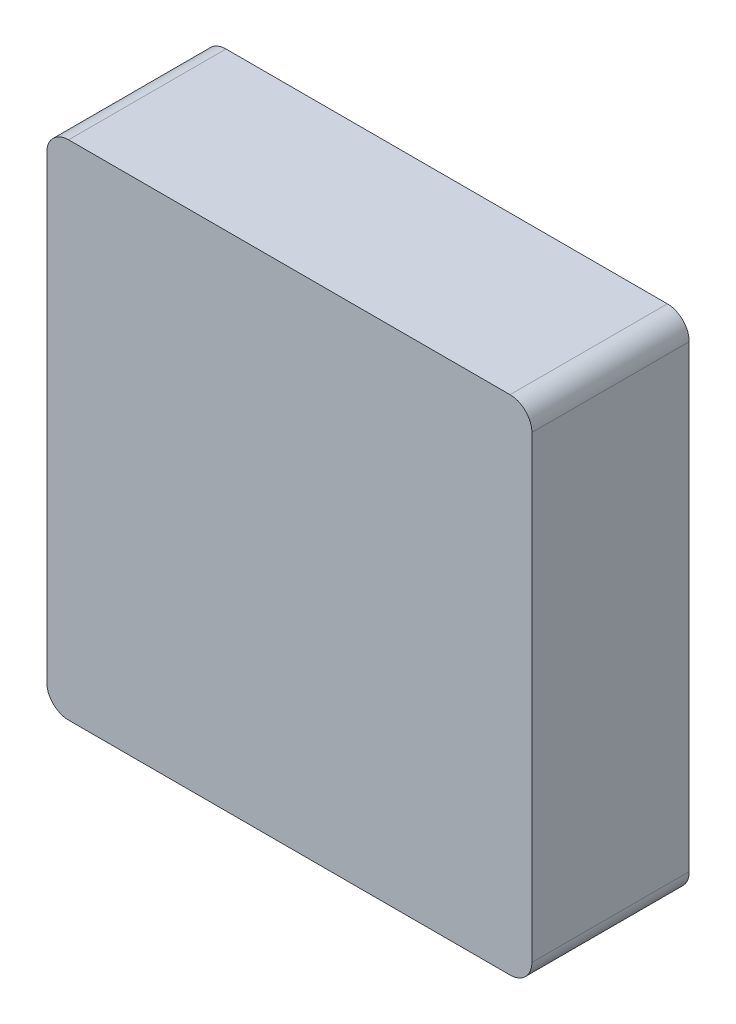
ISO-10303-21;
HEADER;
FILE_DESCRIPTION(('STEP AP214'),'2;1');
FILE_NAME('part.step','',(''),(''),'','','');
FILE_SCHEMA(('AUTOMOTIVE_DESIGN { 1 0 10303 214 1 1 1 1 }'));
ENDSEC;
DATA;
#1=APPLICATION_CONTEXT('core data for automotive mechanical design processes');
#2=APPLICATION_PROTOCOL_DEFINITION('international standard','automotive_design',2000,#1);
#3=PRODUCT_CONTEXT('',#1,'mechanical');
#4=PRODUCT('Part','Part','',(#3));
#5=PRODUCT_RELATED_PRODUCT_CATEGORY('part','',(#4));
#6=PRODUCT_DEFINITION_FORMATION('','',#4);
#7=PRODUCT_DEFINITION_CONTEXT('part definition',#1,'design');
#8=PRODUCT_DEFINITION('design','',#6,#7);
#9=PRODUCT_DEFINITION_SHAPE('','',#8);
#10=(LENGTH_UNIT() NAMED_UNIT(*) SI_UNIT(.MILLI.,.METRE.));
#11=(NAMED_UNIT(*) PLANE_ANGLE_UNIT() SI_UNIT($,.RADIAN.));
#12=(NAMED_UNIT(*) SI_UNIT($,.STERADIAN.) SOLID_ANGLE_UNIT());
#13=UNCERTAINTY_MEASURE_WITH_UNIT(LENGTH_MEASURE(1.E-05),#10,'distance_accuracy_value','');
#14=(GEOMETRIC_REPRESENTATION_CONTEXT(3) GLOBAL_UNCERTAINTY_ASSIGNED_CONTEXT((#13)) GLOBAL_UNIT_ASSIGNED_CONTEXT((#10,
#11,#12)) REPRESENTATION_CONTEXT('',''));
#15=CARTESIAN_POINT('',(0.,0.,0.));
#16=DIRECTION('',(0.,0.,1.));
#17=DIRECTION('',(1.,0.,0.));
#18=AXIS2_PLACEMENT_3D('',#15,#16,#17);
#19=CARTESIAN_POINT('',(55.5,-57.5,36.));
#20=DIRECTION('',(-1.,0.,0.));
#21=DIRECTION('',(0.,0.,1.));
#22=AXIS2_PLACEMENT_3D('',#19,#20,#21);
#23=PLANE('',#22);
#24=DIRECTION('',(0.,1.,0.));
#25=VECTOR('',#24,1.);
#26=CARTESIAN_POINT('',(55.5,-57.5,36.));
#27=LINE('',#26,#25);
#28=CARTESIAN_POINT('',(55.5,-52.5,36.));
#29=VERTEX_POINT('',#28);
#30=CARTESIAN_POINT('',(55.5,52.5,36.));
#31=VERTEX_POINT('',#30);
#32=EDGE_CURVE('E122',#29,#31,#27,.T.);
#33=ORIENTED_EDGE('',*,*,#32,.F.);
#34=DIRECTION('',(0.,0.,-1.));
#35=VECTOR('',#34,1.);
#36=CARTESIAN_POINT('',(55.5,-52.5,36.));
#37=LINE('',#36,#35);
#38=CARTESIAN_POINT('',(55.5,-52.5,0.));
#39=VERTEX_POINT('',#38);
#40=EDGE_CURVE('E107',#29,#39,#37,.T.);
#41=ORIENTED_EDGE('',*,*,#40,.T.);
#42=DIRECTION('',(0.,1.,0.));
#43=VECTOR('',#42,1.);
#44=CARTESIAN_POINT('',(55.5,-57.5,0.));
#45=LINE('',#44,#43);
#46=CARTESIAN_POINT('',(55.5,52.5,0.));
#47=VERTEX_POINT('',#46);
#48=EDGE_CURVE('E119',#39,#47,#45,.T.);
#49=ORIENTED_EDGE('',*,*,#48,.T.);
#50=DIRECTION('',(0.,0.,-1.));
#51=VECTOR('',#50,1.);
#52=CARTESIAN_POINT('',(55.5,52.5,36.));
#53=LINE('',#52,#51);
#54=EDGE_CURVE('E124',#47,#31,#53,.F.);
#55=ORIENTED_EDGE('',*,*,#54,.T.);
#56=EDGE_LOOP('',(#33,#41,#49,#55));
#57=FACE_BOUND('',#56,.T.);
#58=ADVANCED_FACE('F36',(#57),#23,.F.);
#59=CARTESIAN_POINT('',(-55.5,57.5,36.));
#60=DIRECTION('',(0.,-1.,0.));
#61=DIRECTION('',(0.,0.,-1.));
#62=AXIS2_PLACEMENT_3D('',#59,#60,#61);
#63=PLANE('',#62);
#64=DIRECTION('',(-1.,0.,0.));
#65=VECTOR('',#64,1.);
#66=CARTESIAN_POINT('',(-55.5,57.5,36.));
#67=LINE('',#66,#65);
#68=CARTESIAN_POINT('',(50.5,57.5,36.));
#69=VERTEX_POINT('',#68);
#70=CARTESIAN_POINT('',(-50.5,57.5,36.));
#71=VERTEX_POINT('',#70);
#72=EDGE_CURVE('E162',#69,#71,#67,.T.);
#73=ORIENTED_EDGE('',*,*,#72,.F.);
#74=DIRECTION('',(0.,0.,-1.));
#75=VECTOR('',#74,1.);
#76=CARTESIAN_POINT('',(50.5,57.5,36.));
#77=LINE('',#76,#75);
#78=CARTESIAN_POINT('',(50.5,57.5,0.));
#79=VERTEX_POINT('',#78);
#80=EDGE_CURVE('E11',#69,#79,#77,.T.);
#81=ORIENTED_EDGE('',*,*,#80,.T.);
#82=DIRECTION('',(-1.,0.,0.));
#83=VECTOR('',#82,1.);
#84=CARTESIAN_POINT('',(-55.5,57.5,0.));
#85=LINE('',#84,#83);
#86=CARTESIAN_POINT('',(-50.5,57.5,0.));
#87=VERTEX_POINT('',#86);
#88=EDGE_CURVE('E129',#79,#87,#85,.T.);
#89=ORIENTED_EDGE('',*,*,#88,.T.);
#90=DIRECTION('',(0.,0.,-1.));
#91=VECTOR('',#90,1.);
#92=CARTESIAN_POINT('',(-50.5,57.5,36.));
#93=LINE('',#92,#91);
#94=EDGE_CURVE('E44',#87,#71,#93,.F.);
#95=ORIENTED_EDGE('',*,*,#94,.T.);
#96=EDGE_LOOP('',(#73,#81,#89,#95));
#97=FACE_BOUND('',#96,.T.);
#98=ADVANCED_FACE('F161',(#97),#63,.F.);
#99=CARTESIAN_POINT('',(-55.5,-57.5,36.));
#100=DIRECTION('',(1.,0.,0.));
#101=DIRECTION('',(0.,0.,-1.));
#102=AXIS2_PLACEMENT_3D('',#99,#100,#101);
#103=PLANE('',#102);
#104=DIRECTION('',(0.,-1.,0.));
#105=VECTOR('',#104,1.);
#106=CARTESIAN_POINT('',(-55.5,-57.5,0.));
#107=LINE('',#106,#105);
#108=CARTESIAN_POINT('',(-55.5,52.5,0.));
#109=VERTEX_POINT('',#108);
#110=CARTESIAN_POINT('',(-55.5,-52.5,0.));
#111=VERTEX_POINT('',#110);
#112=EDGE_CURVE('E132',#109,#111,#107,.T.);
#113=ORIENTED_EDGE('',*,*,#112,.T.);
#114=DIRECTION('',(0.,0.,-1.));
#115=VECTOR('',#114,1.);
#116=CARTESIAN_POINT('',(-55.5,-52.5,36.));
#117=LINE('',#116,#115);
#118=CARTESIAN_POINT('',(-55.5,-52.5,36.));
#119=VERTEX_POINT('',#118);
#120=EDGE_CURVE('E51',#111,#119,#117,.F.);
#121=ORIENTED_EDGE('',*,*,#120,.T.);
#122=DIRECTION('',(0.,-1.,0.));
#123=VECTOR('',#122,1.);
#124=CARTESIAN_POINT('',(-55.5,-57.5,36.));
#125=LINE('',#124,#123);
#126=CARTESIAN_POINT('',(-55.5,52.5,36.));
#127=VERTEX_POINT('',#126);
#128=EDGE_CURVE('E168',#127,#119,#125,.T.);
#129=ORIENTED_EDGE('',*,*,#128,.F.);
#130=DIRECTION('',(0.,0.,-1.));
#131=VECTOR('',#130,1.);
#132=CARTESIAN_POINT('',(-55.5,52.5,36.));
#133=LINE('',#132,#131);
#134=EDGE_CURVE('E155',#127,#109,#133,.T.);
#135=ORIENTED_EDGE('',*,*,#134,.T.);
#136=EDGE_LOOP('',(#113,#121,#129,#135));
#137=FACE_BOUND('',#136,.T.);
#138=ADVANCED_FACE('F172',(#137),#103,.F.);
#139=CARTESIAN_POINT('',(-55.5,-57.5,36.));
#140=DIRECTION('',(0.,1.,0.));
#141=DIRECTION('',(0.,0.,1.));
#142=AXIS2_PLACEMENT_3D('',#139,#140,#141);
#143=PLANE('',#142);
#144=DIRECTION('',(1.,0.,0.));
#145=VECTOR('',#144,1.);
#146=CARTESIAN_POINT('',(-55.5,-57.5,0.));
#147=LINE('',#146,#145);
#148=CARTESIAN_POINT('',(-50.5,-57.5,0.));
#149=VERTEX_POINT('',#148);
#150=CARTESIAN_POINT('',(50.5,-57.5,0.));
#151=VERTEX_POINT('',#150);
#152=EDGE_CURVE('E139',#149,#151,#147,.T.);
#153=ORIENTED_EDGE('',*,*,#152,.T.);
#154=DIRECTION('',(0.,0.,-1.));
#155=VECTOR('',#154,1.);
#156=CARTESIAN_POINT('',(50.5,-57.5,36.));
#157=LINE('',#156,#155);
#158=CARTESIAN_POINT('',(50.5,-57.5,36.));
#159=VERTEX_POINT('',#158);
#160=EDGE_CURVE('E108',#151,#159,#157,.F.);
#161=ORIENTED_EDGE('',*,*,#160,.T.);
#162=DIRECTION('',(1.,0.,0.));
#163=VECTOR('',#162,1.);
#164=CARTESIAN_POINT('',(-55.5,-57.5,36.));
#165=LINE('',#164,#163);
#166=CARTESIAN_POINT('',(-50.5,-57.5,36.));
#167=VERTEX_POINT('',#166);
#168=EDGE_CURVE('E135',#167,#159,#165,.T.);
#169=ORIENTED_EDGE('',*,*,#168,.F.);
#170=DIRECTION('',(0.,0.,-1.));
#171=VECTOR('',#170,1.);
#172=CARTESIAN_POINT('',(-50.5,-57.5,36.));
#173=LINE('',#172,#171);
#174=EDGE_CURVE('E113',#167,#149,#173,.T.);
#175=ORIENTED_EDGE('',*,*,#174,.T.);
#176=EDGE_LOOP('',(#153,#161,#169,#175));
#177=FACE_BOUND('',#176,.T.);
#178=ADVANCED_FACE('F179',(#177),#143,.F.);
#179=CARTESIAN_POINT('',(0.,0.,36.));
#180=DIRECTION('',(0.,0.,-1.));
#181=DIRECTION('',(-1.,0.,0.));
#182=AXIS2_PLACEMENT_3D('',#179,#180,#181);
#183=PLANE('',#182);
#184=ORIENTED_EDGE('',*,*,#168,.T.);
#185=CARTESIAN_POINT('',(50.5,-52.5,36.));
#186=DIRECTION('',(0.,0.,-1.));
#187=DIRECTION('',(-1.,0.,0.));
#188=AXIS2_PLACEMENT_3D('',#185,#186,#187);
#189=CIRCLE('',#188,5.);
#190=EDGE_CURVE('E153',#159,#29,#189,.F.);
#191=ORIENTED_EDGE('',*,*,#190,.T.);
#192=ORIENTED_EDGE('',*,*,#32,.T.);
#193=CARTESIAN_POINT('',(50.5,52.5,36.));
#194=DIRECTION('',(0.,0.,-1.));
#195=DIRECTION('',(-1.,0.,0.));
#196=AXIS2_PLACEMENT_3D('',#193,#194,#195);
#197=CIRCLE('',#196,5.);
#198=EDGE_CURVE('E149',#31,#69,#197,.F.);
#199=ORIENTED_EDGE('',*,*,#198,.T.);
#200=ORIENTED_EDGE('',*,*,#72,.T.);
#201=CARTESIAN_POINT('',(-50.5,52.5,36.));
#202=DIRECTION('',(0.,0.,-1.));
#203=DIRECTION('',(-1.,0.,0.));
#204=AXIS2_PLACEMENT_3D('',#201,#202,#203);
#205=CIRCLE('',#204,5.);
#206=EDGE_CURVE('E58',#71,#127,#205,.F.);
#207=ORIENTED_EDGE('',*,*,#206,.T.);
#208=ORIENTED_EDGE('',*,*,#128,.T.);
#209=CARTESIAN_POINT('',(-50.5,-52.5,36.));
#210=DIRECTION('',(0.,0.,-1.));
#211=DIRECTION('',(-1.,0.,0.));
#212=AXIS2_PLACEMENT_3D('',#209,#210,#211);
#213=CIRCLE('',#212,5.);
#214=EDGE_CURVE('E151',#119,#167,#213,.F.);
#215=ORIENTED_EDGE('',*,*,#214,.T.);
#216=EDGE_LOOP('',(#184,#191,#192,#199,#200,#207,#208,#215));
#217=FACE_BOUND('',#216,.T.);
#218=ADVANCED_FACE('F166',(#217),#183,.F.);
#219=CARTESIAN_POINT('',(0.,0.,0.));
#220=DIRECTION('',(0.,0.,-1.));
#221=DIRECTION('',(-1.,0.,0.));
#222=AXIS2_PLACEMENT_3D('',#219,#220,#221);
#223=PLANE('',#222);
#224=ORIENTED_EDGE('',*,*,#48,.F.);
#225=CARTESIAN_POINT('',(50.5,-52.5,0.));
#226=DIRECTION('',(0.,0.,-1.));
#227=DIRECTION('',(-1.,0.,0.));
#228=AXIS2_PLACEMENT_3D('',#225,#226,#227);
#229=CIRCLE('',#228,5.);
#230=EDGE_CURVE('E103',#39,#151,#229,.T.);
#231=ORIENTED_EDGE('',*,*,#230,.T.);
#232=ORIENTED_EDGE('',*,*,#152,.F.);
#233=CARTESIAN_POINT('',(-50.5,-52.5,0.));
#234=DIRECTION('',(0.,0.,-1.));
#235=DIRECTION('',(-1.,0.,0.));
#236=AXIS2_PLACEMENT_3D('',#233,#234,#235);
#237=CIRCLE('',#236,5.);
#238=EDGE_CURVE('E114',#149,#111,#237,.T.);
#239=ORIENTED_EDGE('',*,*,#238,.T.);
#240=ORIENTED_EDGE('',*,*,#112,.F.);
#241=CARTESIAN_POINT('',(-50.5,52.5,0.));
#242=DIRECTION('',(0.,0.,-1.));
#243=DIRECTION('',(-1.,0.,0.));
#244=AXIS2_PLACEMENT_3D('',#241,#242,#243);
#245=CIRCLE('',#244,5.);
#246=EDGE_CURVE('E123',#109,#87,#245,.T.);
#247=ORIENTED_EDGE('',*,*,#246,.T.);
#248=ORIENTED_EDGE('',*,*,#88,.F.);
#249=CARTESIAN_POINT('',(50.5,52.5,0.));
#250=DIRECTION('',(0.,0.,-1.));
#251=DIRECTION('',(-1.,0.,0.));
#252=AXIS2_PLACEMENT_3D('',#249,#250,#251);
#253=CIRCLE('',#252,5.);
#254=EDGE_CURVE('E128',#79,#47,#253,.T.);
#255=ORIENTED_EDGE('',*,*,#254,.T.);
#256=EDGE_LOOP('',(#224,#231,#232,#239,#240,#247,#248,#255));
#257=FACE_BOUND('',#256,.T.);
#258=ADVANCED_FACE('F126',(#257),#223,.T.);
#259=CARTESIAN_POINT('',(50.5,-52.5,36.));
#260=DIRECTION('',(0.,0.,-1.));
#261=DIRECTION('',(-1.,0.,0.));
#262=AXIS2_PLACEMENT_3D('',#259,#260,#261);
#263=CYLINDRICAL_SURFACE('',#262,5.);
#264=ORIENTED_EDGE('',*,*,#190,.F.);
#265=ORIENTED_EDGE('',*,*,#160,.F.);
#266=ORIENTED_EDGE('',*,*,#230,.F.);
#267=ORIENTED_EDGE('',*,*,#40,.F.);
#268=EDGE_LOOP('',(#264,#265,#266,#267));
#269=FACE_BOUND('',#268,.T.);
#270=ADVANCED_FACE('F106',(#269),#263,.T.);
#271=CARTESIAN_POINT('',(-50.5,-52.5,36.));
#272=DIRECTION('',(0.,0.,-1.));
#273=DIRECTION('',(-1.,0.,0.));
#274=AXIS2_PLACEMENT_3D('',#271,#272,#273);
#275=CYLINDRICAL_SURFACE('',#274,5.);
#276=ORIENTED_EDGE('',*,*,#214,.F.);
#277=ORIENTED_EDGE('',*,*,#120,.F.);
#278=ORIENTED_EDGE('',*,*,#238,.F.);
#279=ORIENTED_EDGE('',*,*,#174,.F.);
#280=EDGE_LOOP('',(#276,#277,#278,#279));
#281=FACE_BOUND('',#280,.T.);
#282=ADVANCED_FACE('F176',(#281),#275,.T.);
#283=CARTESIAN_POINT('',(50.5,52.5,36.));
#284=DIRECTION('',(0.,0.,-1.));
#285=DIRECTION('',(-1.,0.,0.));
#286=AXIS2_PLACEMENT_3D('',#283,#284,#285);
#287=CYLINDRICAL_SURFACE('',#286,5.);
#288=ORIENTED_EDGE('',*,*,#198,.F.);
#289=ORIENTED_EDGE('',*,*,#54,.F.);
#290=ORIENTED_EDGE('',*,*,#254,.F.);
#291=ORIENTED_EDGE('',*,*,#80,.F.);
#292=EDGE_LOOP('',(#288,#289,#290,#291));
#293=FACE_BOUND('',#292,.T.);
#294=ADVANCED_FACE('F182',(#293),#287,.T.);
#295=CARTESIAN_POINT('',(-50.5,52.5,36.));
#296=DIRECTION('',(0.,0.,-1.));
#297=DIRECTION('',(-1.,0.,0.));
#298=AXIS2_PLACEMENT_3D('',#295,#296,#297);
#299=CYLINDRICAL_SURFACE('',#298,5.);
#300=ORIENTED_EDGE('',*,*,#206,.F.);
#301=ORIENTED_EDGE('',*,*,#94,.F.);
#302=ORIENTED_EDGE('',*,*,#246,.F.);
#303=ORIENTED_EDGE('',*,*,#134,.F.);
#304=EDGE_LOOP('',(#300,#301,#302,#303));
#305=FACE_BOUND('',#304,.T.);
#306=ADVANCED_FACE('F38',(#305),#299,.T.);
#307=CLOSED_SHELL('',(#58,#98,#138,#178,#218,#258,#270,#282,#294,#306));
#308=MANIFOLD_SOLID_BREP('B2',#307);
#309=ADVANCED_BREP_SHAPE_REPRESENTATION('',(#18,#308),#14);
#310=SHAPE_DEFINITION_REPRESENTATION(#9,#309);
ENDSEC;
END-ISO-10303-21;
